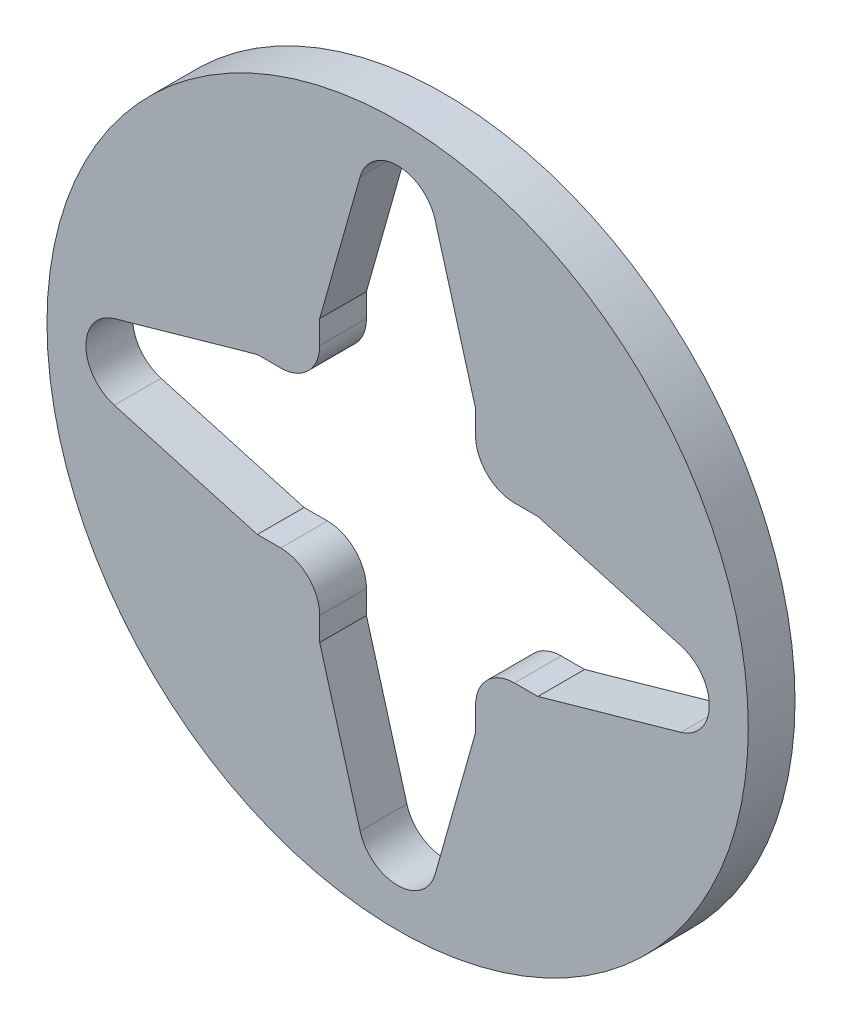
ISO-10303-21;
HEADER;
FILE_DESCRIPTION(('STEP AP214'),'2;1');
FILE_NAME('part.step','',(''),(''),'','','');
FILE_SCHEMA(('AUTOMOTIVE_DESIGN { 1 0 10303 214 1 1 1 1 }'));
ENDSEC;
DATA;
#1=APPLICATION_CONTEXT('core data for automotive mechanical design processes');
#2=APPLICATION_PROTOCOL_DEFINITION('international standard','automotive_design',2000,#1);
#3=PRODUCT_CONTEXT('',#1,'mechanical');
#4=PRODUCT('Part','Part','',(#3));
#5=PRODUCT_RELATED_PRODUCT_CATEGORY('part','',(#4));
#6=PRODUCT_DEFINITION_FORMATION('','',#4);
#7=PRODUCT_DEFINITION_CONTEXT('part definition',#1,'design');
#8=PRODUCT_DEFINITION('design','',#6,#7);
#9=PRODUCT_DEFINITION_SHAPE('','',#8);
#10=(LENGTH_UNIT() NAMED_UNIT(*) SI_UNIT(.MILLI.,.METRE.));
#11=(NAMED_UNIT(*) PLANE_ANGLE_UNIT() SI_UNIT($,.RADIAN.));
#12=(NAMED_UNIT(*) SI_UNIT($,.STERADIAN.) SOLID_ANGLE_UNIT());
#13=UNCERTAINTY_MEASURE_WITH_UNIT(LENGTH_MEASURE(1.E-05),#10,'distance_accuracy_value','');
#14=(GEOMETRIC_REPRESENTATION_CONTEXT(3) GLOBAL_UNCERTAINTY_ASSIGNED_CONTEXT((#13)) GLOBAL_UNIT_ASSIGNED_CONTEXT((#10,
#11,#12)) REPRESENTATION_CONTEXT('',''));
#15=CARTESIAN_POINT('',(0.,0.,0.));
#16=DIRECTION('',(0.,0.,1.));
#17=DIRECTION('',(1.,0.,0.));
#18=AXIS2_PLACEMENT_3D('',#15,#16,#17);
#19=CARTESIAN_POINT('',(0.,0.,3.));
#20=DIRECTION('',(0.,0.,-1.));
#21=DIRECTION('',(-1.,0.,0.));
#22=AXIS2_PLACEMENT_3D('',#19,#20,#21);
#23=CYLINDRICAL_SURFACE('',#22,22.5);
#24=CARTESIAN_POINT('',(0.,0.,0.));
#25=DIRECTION('',(0.,0.,1.));
#26=DIRECTION('',(1.,0.,0.));
#27=AXIS2_PLACEMENT_3D('',#24,#25,#26);
#28=CIRCLE('',#27,22.5);
#29=CARTESIAN_POINT('',(22.5,0.,0.));
#30=VERTEX_POINT('',#29);
#31=EDGE_CURVE('E427',#30,#30,#28,.T.);
#32=ORIENTED_EDGE('',*,*,#31,.T.);
#33=EDGE_LOOP('',(#32));
#34=FACE_BOUND('',#33,.T.);
#35=CARTESIAN_POINT('',(0.,0.,3.));
#36=DIRECTION('',(0.,0.,1.));
#37=DIRECTION('',(1.,0.,0.));
#38=AXIS2_PLACEMENT_3D('',#35,#36,#37);
#39=CIRCLE('',#38,22.5);
#40=CARTESIAN_POINT('',(22.5,0.,3.));
#41=VERTEX_POINT('',#40);
#42=EDGE_CURVE('E369',#41,#41,#39,.T.);
#43=ORIENTED_EDGE('',*,*,#42,.F.);
#44=EDGE_LOOP('',(#43));
#45=FACE_BOUND('',#44,.T.);
#46=ADVANCED_FACE('F181',(#34,#45),#23,.T.);
#47=CARTESIAN_POINT('',(5.,0.,3.));
#48=DIRECTION('',(1.,0.,0.));
#49=DIRECTION('',(0.,0.,-1.));
#50=AXIS2_PLACEMENT_3D('',#47,#48,#49);
#51=PLANE('',#50);
#52=DIRECTION('',(0.,-1.,0.));
#53=VECTOR('',#52,1.);
#54=CARTESIAN_POINT('',(5.,0.,0.));
#55=LINE('',#54,#53);
#56=CARTESIAN_POINT('',(5.,-7.5,0.));
#57=VERTEX_POINT('',#56);
#58=CARTESIAN_POINT('',(5.,-9.,0.));
#59=VERTEX_POINT('',#58);
#60=EDGE_CURVE('E375',#57,#59,#55,.T.);
#61=ORIENTED_EDGE('',*,*,#60,.T.);
#62=DIRECTION('',(0.,0.,-1.));
#63=VECTOR('',#62,1.);
#64=CARTESIAN_POINT('',(5.,-9.,3.));
#65=LINE('',#64,#63);
#66=CARTESIAN_POINT('',(5.,-9.,3.));
#67=VERTEX_POINT('',#66);
#68=EDGE_CURVE('E191',#67,#59,#65,.T.);
#69=ORIENTED_EDGE('',*,*,#68,.F.);
#70=DIRECTION('',(0.,-1.,0.));
#71=VECTOR('',#70,1.);
#72=CARTESIAN_POINT('',(5.,0.,3.));
#73=LINE('',#72,#71);
#74=CARTESIAN_POINT('',(5.,-7.5,3.));
#75=VERTEX_POINT('',#74);
#76=EDGE_CURVE('E430',#75,#67,#73,.T.);
#77=ORIENTED_EDGE('',*,*,#76,.F.);
#78=DIRECTION('',(0.,0.,-1.));
#79=VECTOR('',#78,1.);
#80=CARTESIAN_POINT('',(5.,-7.5,3.));
#81=LINE('',#80,#79);
#82=EDGE_CURVE('E12',#75,#57,#81,.T.);
#83=ORIENTED_EDGE('',*,*,#82,.T.);
#84=EDGE_LOOP('',(#61,#69,#77,#83));
#85=FACE_BOUND('',#84,.T.);
#86=ADVANCED_FACE('F528',(#85),#51,.F.);
#87=CARTESIAN_POINT('',(6.98551163473582,-1.97409711694024,3.));
#88=DIRECTION('',(0.962311898410698,-0.271948175535705,0.));
#89=DIRECTION('',(0.271948175535705,0.962311898410698,0.));
#90=AXIS2_PLACEMENT_3D('',#87,#88,#89);
#91=PLANE('',#90);
#92=DIRECTION('',(-0.271948175535705,-0.962311898410698,0.));
#93=VECTOR('',#92,1.);
#94=CARTESIAN_POINT('',(6.98551163473582,-1.97409711694024,0.));
#95=LINE('',#94,#93);
#96=CARTESIAN_POINT('',(2.40577974602674,-18.1798704388393,0.));
#97=VERTEX_POINT('',#96);
#98=EDGE_CURVE('E377',#59,#97,#95,.T.);
#99=ORIENTED_EDGE('',*,*,#98,.T.);
#100=DIRECTION('',(0.,0.,-1.));
#101=VECTOR('',#100,1.);
#102=CARTESIAN_POINT('',(2.40577974602674,-18.1798704388393,3.));
#103=LINE('',#102,#101);
#104=CARTESIAN_POINT('',(2.40577974602674,-18.1798704388393,3.));
#105=VERTEX_POINT('',#104);
#106=EDGE_CURVE('E472',#105,#97,#103,.T.);
#107=ORIENTED_EDGE('',*,*,#106,.F.);
#108=DIRECTION('',(-0.271948175535705,-0.962311898410698,0.));
#109=VECTOR('',#108,1.);
#110=CARTESIAN_POINT('',(6.98551163473582,-1.97409711694024,3.));
#111=LINE('',#110,#109);
#112=EDGE_CURVE('E524',#67,#105,#111,.T.);
#113=ORIENTED_EDGE('',*,*,#112,.F.);
#114=ORIENTED_EDGE('',*,*,#68,.T.);
#115=EDGE_LOOP('',(#99,#107,#113,#114));
#116=FACE_BOUND('',#115,.T.);
#117=ADVANCED_FACE('F523',(#116),#91,.F.);
#118=CARTESIAN_POINT('',(0.,-17.5,3.));
#119=DIRECTION('',(0.,0.,-1.));
#120=DIRECTION('',(-1.,0.,0.));
#121=AXIS2_PLACEMENT_3D('',#118,#119,#120);
#122=CYLINDRICAL_SURFACE('',#121,2.5);
#123=CARTESIAN_POINT('',(0.,-17.5,0.));
#124=DIRECTION('',(0.,0.,1.));
#125=DIRECTION('',(1.,0.,0.));
#126=AXIS2_PLACEMENT_3D('',#123,#124,#125);
#127=CIRCLE('',#126,2.5);
#128=CARTESIAN_POINT('',(-2.40577974602674,-18.1798704388393,0.));
#129=VERTEX_POINT('',#128);
#130=EDGE_CURVE('E380',#97,#129,#127,.F.);
#131=ORIENTED_EDGE('',*,*,#130,.T.);
#132=DIRECTION('',(0.,0.,-1.));
#133=VECTOR('',#132,1.);
#134=CARTESIAN_POINT('',(-2.40577974602674,-18.1798704388393,3.));
#135=LINE('',#134,#133);
#136=CARTESIAN_POINT('',(-2.40577974602674,-18.1798704388393,3.));
#137=VERTEX_POINT('',#136);
#138=EDGE_CURVE('E470',#137,#129,#135,.T.);
#139=ORIENTED_EDGE('',*,*,#138,.F.);
#140=CARTESIAN_POINT('',(0.,-17.5,3.));
#141=DIRECTION('',(0.,0.,1.));
#142=DIRECTION('',(1.,0.,0.));
#143=AXIS2_PLACEMENT_3D('',#140,#141,#142);
#144=CIRCLE('',#143,2.5);
#145=EDGE_CURVE('E520',#105,#137,#144,.F.);
#146=ORIENTED_EDGE('',*,*,#145,.F.);
#147=ORIENTED_EDGE('',*,*,#106,.T.);
#148=EDGE_LOOP('',(#131,#139,#146,#147));
#149=FACE_BOUND('',#148,.T.);
#150=ADVANCED_FACE('F517',(#149),#122,.F.);
#151=CARTESIAN_POINT('',(-6.98551163473582,-1.97409711694024,3.));
#152=DIRECTION('',(0.962311898410698,0.271948175535705,0.));
#153=DIRECTION('',(-0.271948175535705,0.962311898410698,0.));
#154=AXIS2_PLACEMENT_3D('',#151,#152,#153);
#155=PLANE('',#154);
#156=DIRECTION('',(0.271948175535705,-0.962311898410698,0.));
#157=VECTOR('',#156,1.);
#158=CARTESIAN_POINT('',(-6.98551163473582,-1.97409711694024,0.));
#159=LINE('',#158,#157);
#160=CARTESIAN_POINT('',(-5.,-9.,0.));
#161=VERTEX_POINT('',#160);
#162=EDGE_CURVE('E383',#161,#129,#159,.T.);
#163=ORIENTED_EDGE('',*,*,#162,.F.);
#164=DIRECTION('',(0.,0.,-1.));
#165=VECTOR('',#164,1.);
#166=CARTESIAN_POINT('',(-5.,-9.,3.));
#167=LINE('',#166,#165);
#168=CARTESIAN_POINT('',(-5.,-9.,3.));
#169=VERTEX_POINT('',#168);
#170=EDGE_CURVE('E468',#169,#161,#167,.T.);
#171=ORIENTED_EDGE('',*,*,#170,.F.);
#172=DIRECTION('',(0.271948175535705,-0.962311898410698,0.));
#173=VECTOR('',#172,1.);
#174=CARTESIAN_POINT('',(-6.98551163473582,-1.97409711694024,3.));
#175=LINE('',#174,#173);
#176=EDGE_CURVE('E827',#169,#137,#175,.T.);
#177=ORIENTED_EDGE('',*,*,#176,.T.);
#178=ORIENTED_EDGE('',*,*,#138,.T.);
#179=EDGE_LOOP('',(#163,#171,#177,#178));
#180=FACE_BOUND('',#179,.T.);
#181=ADVANCED_FACE('F512',(#180),#155,.T.);
#182=CARTESIAN_POINT('',(-5.,0.,3.));
#183=DIRECTION('',(1.,0.,0.));
#184=DIRECTION('',(0.,0.,-1.));
#185=AXIS2_PLACEMENT_3D('',#182,#183,#184);
#186=PLANE('',#185);
#187=DIRECTION('',(0.,-1.,0.));
#188=VECTOR('',#187,1.);
#189=CARTESIAN_POINT('',(-5.,0.,0.));
#190=LINE('',#189,#188);
#191=CARTESIAN_POINT('',(-5.,-7.5,0.));
#192=VERTEX_POINT('',#191);
#193=EDGE_CURVE('E386',#192,#161,#190,.T.);
#194=ORIENTED_EDGE('',*,*,#193,.F.);
#195=DIRECTION('',(0.,0.,-1.));
#196=VECTOR('',#195,1.);
#197=CARTESIAN_POINT('',(-5.,-7.5,3.));
#198=LINE('',#197,#196);
#199=CARTESIAN_POINT('',(-5.,-7.5,3.));
#200=VERTEX_POINT('',#199);
#201=EDGE_CURVE('E466',#200,#192,#198,.T.);
#202=ORIENTED_EDGE('',*,*,#201,.F.);
#203=DIRECTION('',(0.,-1.,0.));
#204=VECTOR('',#203,1.);
#205=CARTESIAN_POINT('',(-5.,0.,3.));
#206=LINE('',#205,#204);
#207=EDGE_CURVE('E508',#200,#169,#206,.T.);
#208=ORIENTED_EDGE('',*,*,#207,.T.);
#209=ORIENTED_EDGE('',*,*,#170,.T.);
#210=EDGE_LOOP('',(#194,#202,#208,#209));
#211=FACE_BOUND('',#210,.T.);
#212=ADVANCED_FACE('F505',(#211),#186,.T.);
#213=CARTESIAN_POINT('',(0.,-5.,3.));
#214=DIRECTION('',(0.,-1.,0.));
#215=DIRECTION('',(1.,0.,0.));
#216=AXIS2_PLACEMENT_3D('',#213,#214,#215);
#217=PLANE('',#216);
#218=DIRECTION('',(-1.,0.,0.));
#219=VECTOR('',#218,1.);
#220=CARTESIAN_POINT('',(0.,-5.,0.));
#221=LINE('',#220,#219);
#222=CARTESIAN_POINT('',(-7.5,-5.,0.));
#223=VERTEX_POINT('',#222);
#224=CARTESIAN_POINT('',(-9.,-5.,0.));
#225=VERTEX_POINT('',#224);
#226=EDGE_CURVE('E389',#223,#225,#221,.T.);
#227=ORIENTED_EDGE('',*,*,#226,.T.);
#228=DIRECTION('',(0.,0.,-1.));
#229=VECTOR('',#228,1.);
#230=CARTESIAN_POINT('',(-9.,-5.,3.));
#231=LINE('',#230,#229);
#232=CARTESIAN_POINT('',(-9.,-5.,3.));
#233=VERTEX_POINT('',#232);
#234=EDGE_CURVE('E461',#233,#225,#231,.T.);
#235=ORIENTED_EDGE('',*,*,#234,.F.);
#236=DIRECTION('',(-1.,0.,0.));
#237=VECTOR('',#236,1.);
#238=CARTESIAN_POINT('',(0.,-5.,3.));
#239=LINE('',#238,#237);
#240=CARTESIAN_POINT('',(-7.5,-5.,3.));
#241=VERTEX_POINT('',#240);
#242=EDGE_CURVE('E826',#241,#233,#239,.T.);
#243=ORIENTED_EDGE('',*,*,#242,.F.);
#244=DIRECTION('',(0.,0.,-1.));
#245=VECTOR('',#244,1.);
#246=CARTESIAN_POINT('',(-7.5,-5.,3.));
#247=LINE('',#246,#245);
#248=EDGE_CURVE('E464',#241,#223,#247,.T.);
#249=ORIENTED_EDGE('',*,*,#248,.T.);
#250=EDGE_LOOP('',(#227,#235,#243,#249));
#251=FACE_BOUND('',#250,.T.);
#252=ADVANCED_FACE('F577',(#251),#217,.F.);
#253=CARTESIAN_POINT('',(-1.97409711694023,-6.98551163473581,3.));
#254=DIRECTION('',(-0.271948175535704,-0.962311898410698,0.));
#255=DIRECTION('',(0.962311898410698,-0.271948175535704,0.));
#256=AXIS2_PLACEMENT_3D('',#253,#254,#255);
#257=PLANE('',#256);
#258=DIRECTION('',(-0.962311898410698,0.271948175535704,0.));
#259=VECTOR('',#258,1.);
#260=CARTESIAN_POINT('',(-1.97409711694023,-6.98551163473581,0.));
#261=LINE('',#260,#259);
#262=CARTESIAN_POINT('',(-18.1798704388393,-2.40577974602675,0.));
#263=VERTEX_POINT('',#262);
#264=EDGE_CURVE('E391',#225,#263,#261,.T.);
#265=ORIENTED_EDGE('',*,*,#264,.T.);
#266=DIRECTION('',(0.,0.,-1.));
#267=VECTOR('',#266,1.);
#268=CARTESIAN_POINT('',(-18.1798704388393,-2.40577974602675,3.));
#269=LINE('',#268,#267);
#270=CARTESIAN_POINT('',(-18.1798704388393,-2.40577974602675,3.));
#271=VERTEX_POINT('',#270);
#272=EDGE_CURVE('E458',#271,#263,#269,.T.);
#273=ORIENTED_EDGE('',*,*,#272,.F.);
#274=DIRECTION('',(-0.962311898410698,0.271948175535704,0.));
#275=VECTOR('',#274,1.);
#276=CARTESIAN_POINT('',(-1.97409711694023,-6.98551163473581,3.));
#277=LINE('',#276,#275);
#278=EDGE_CURVE('E823',#233,#271,#277,.T.);
#279=ORIENTED_EDGE('',*,*,#278,.F.);
#280=ORIENTED_EDGE('',*,*,#234,.T.);
#281=EDGE_LOOP('',(#265,#273,#279,#280));
#282=FACE_BOUND('',#281,.T.);
#283=ADVANCED_FACE('F580',(#282),#257,.F.);
#284=CARTESIAN_POINT('',(-17.5,0.,3.));
#285=DIRECTION('',(0.,0.,-1.));
#286=DIRECTION('',(-1.,0.,0.));
#287=AXIS2_PLACEMENT_3D('',#284,#285,#286);
#288=CYLINDRICAL_SURFACE('',#287,2.5);
#289=CARTESIAN_POINT('',(-17.5,0.,0.));
#290=DIRECTION('',(0.,0.,1.));
#291=DIRECTION('',(1.,0.,0.));
#292=AXIS2_PLACEMENT_3D('',#289,#290,#291);
#293=CIRCLE('',#292,2.5);
#294=CARTESIAN_POINT('',(-18.1798704388393,2.40577974602675,0.));
#295=VERTEX_POINT('',#294);
#296=EDGE_CURVE('E393',#263,#295,#293,.F.);
#297=ORIENTED_EDGE('',*,*,#296,.T.);
#298=DIRECTION('',(0.,0.,-1.));
#299=VECTOR('',#298,1.);
#300=CARTESIAN_POINT('',(-18.1798704388393,2.40577974602675,3.));
#301=LINE('',#300,#299);
#302=CARTESIAN_POINT('',(-18.1798704388393,2.40577974602675,3.));
#303=VERTEX_POINT('',#302);
#304=EDGE_CURVE('E456',#303,#295,#301,.T.);
#305=ORIENTED_EDGE('',*,*,#304,.F.);
#306=CARTESIAN_POINT('',(-17.5,0.,3.));
#307=DIRECTION('',(0.,0.,1.));
#308=DIRECTION('',(1.,0.,0.));
#309=AXIS2_PLACEMENT_3D('',#306,#307,#308);
#310=CIRCLE('',#309,2.5);
#311=EDGE_CURVE('E821',#271,#303,#310,.F.);
#312=ORIENTED_EDGE('',*,*,#311,.F.);
#313=ORIENTED_EDGE('',*,*,#272,.T.);
#314=EDGE_LOOP('',(#297,#305,#312,#313));
#315=FACE_BOUND('',#314,.T.);
#316=ADVANCED_FACE('F584',(#315),#288,.F.);
#317=CARTESIAN_POINT('',(-1.97409711694023,6.98551163473581,3.));
#318=DIRECTION('',(0.271948175535704,-0.962311898410698,0.));
#319=DIRECTION('',(0.962311898410698,0.271948175535704,0.));
#320=AXIS2_PLACEMENT_3D('',#317,#318,#319);
#321=PLANE('',#320);
#322=DIRECTION('',(-0.962311898410698,-0.271948175535704,0.));
#323=VECTOR('',#322,1.);
#324=CARTESIAN_POINT('',(-1.97409711694023,6.98551163473581,0.));
#325=LINE('',#324,#323);
#326=CARTESIAN_POINT('',(-9.,5.,0.));
#327=VERTEX_POINT('',#326);
#328=EDGE_CURVE('E396',#327,#295,#325,.T.);
#329=ORIENTED_EDGE('',*,*,#328,.F.);
#330=DIRECTION('',(0.,0.,-1.));
#331=VECTOR('',#330,1.);
#332=CARTESIAN_POINT('',(-9.,5.,3.));
#333=LINE('',#332,#331);
#334=CARTESIAN_POINT('',(-9.,5.,3.));
#335=VERTEX_POINT('',#334);
#336=EDGE_CURVE('E454',#335,#327,#333,.T.);
#337=ORIENTED_EDGE('',*,*,#336,.F.);
#338=DIRECTION('',(-0.962311898410698,-0.271948175535704,0.));
#339=VECTOR('',#338,1.);
#340=CARTESIAN_POINT('',(-1.97409711694023,6.98551163473581,3.));
#341=LINE('',#340,#339);
#342=EDGE_CURVE('E818',#335,#303,#341,.T.);
#343=ORIENTED_EDGE('',*,*,#342,.T.);
#344=ORIENTED_EDGE('',*,*,#304,.T.);
#345=EDGE_LOOP('',(#329,#337,#343,#344));
#346=FACE_BOUND('',#345,.T.);
#347=ADVANCED_FACE('F588',(#346),#321,.T.);
#348=CARTESIAN_POINT('',(0.,5.,3.));
#349=DIRECTION('',(0.,-1.,0.));
#350=DIRECTION('',(1.,0.,0.));
#351=AXIS2_PLACEMENT_3D('',#348,#349,#350);
#352=PLANE('',#351);
#353=DIRECTION('',(-1.,0.,0.));
#354=VECTOR('',#353,1.);
#355=CARTESIAN_POINT('',(0.,5.,0.));
#356=LINE('',#355,#354);
#357=CARTESIAN_POINT('',(-7.5,5.,0.));
#358=VERTEX_POINT('',#357);
#359=EDGE_CURVE('E399',#358,#327,#356,.T.);
#360=ORIENTED_EDGE('',*,*,#359,.F.);
#361=DIRECTION('',(0.,0.,-1.));
#362=VECTOR('',#361,1.);
#363=CARTESIAN_POINT('',(-7.5,5.,3.));
#364=LINE('',#363,#362);
#365=CARTESIAN_POINT('',(-7.5,5.,3.));
#366=VERTEX_POINT('',#365);
#367=EDGE_CURVE('E452',#366,#358,#364,.T.);
#368=ORIENTED_EDGE('',*,*,#367,.F.);
#369=DIRECTION('',(-1.,0.,0.));
#370=VECTOR('',#369,1.);
#371=CARTESIAN_POINT('',(0.,5.,3.));
#372=LINE('',#371,#370);
#373=EDGE_CURVE('E812',#366,#335,#372,.T.);
#374=ORIENTED_EDGE('',*,*,#373,.T.);
#375=ORIENTED_EDGE('',*,*,#336,.T.);
#376=EDGE_LOOP('',(#360,#368,#374,#375));
#377=FACE_BOUND('',#376,.T.);
#378=ADVANCED_FACE('F592',(#377),#352,.T.);
#379=CARTESIAN_POINT('',(-5.,0.,3.));
#380=DIRECTION('',(-1.,0.,0.));
#381=DIRECTION('',(0.,0.,1.));
#382=AXIS2_PLACEMENT_3D('',#379,#380,#381);
#383=PLANE('',#382);
#384=DIRECTION('',(0.,1.,0.));
#385=VECTOR('',#384,1.);
#386=CARTESIAN_POINT('',(-5.,0.,0.));
#387=LINE('',#386,#385);
#388=CARTESIAN_POINT('',(-5.,7.5,0.));
#389=VERTEX_POINT('',#388);
#390=CARTESIAN_POINT('',(-5.,9.,0.));
#391=VERTEX_POINT('',#390);
#392=EDGE_CURVE('E402',#389,#391,#387,.T.);
#393=ORIENTED_EDGE('',*,*,#392,.T.);
#394=DIRECTION('',(0.,0.,-1.));
#395=VECTOR('',#394,1.);
#396=CARTESIAN_POINT('',(-5.,9.,3.));
#397=LINE('',#396,#395);
#398=CARTESIAN_POINT('',(-5.,9.,3.));
#399=VERTEX_POINT('',#398);
#400=EDGE_CURVE('E447',#399,#391,#397,.T.);
#401=ORIENTED_EDGE('',*,*,#400,.F.);
#402=DIRECTION('',(0.,1.,0.));
#403=VECTOR('',#402,1.);
#404=CARTESIAN_POINT('',(-5.,0.,3.));
#405=LINE('',#404,#403);
#406=CARTESIAN_POINT('',(-5.,7.5,3.));
#407=VERTEX_POINT('',#406);
#408=EDGE_CURVE('E808',#407,#399,#405,.T.);
#409=ORIENTED_EDGE('',*,*,#408,.F.);
#410=DIRECTION('',(0.,0.,-1.));
#411=VECTOR('',#410,1.);
#412=CARTESIAN_POINT('',(-5.,7.5,3.));
#413=LINE('',#412,#411);
#414=EDGE_CURVE('E450',#407,#389,#413,.T.);
#415=ORIENTED_EDGE('',*,*,#414,.T.);
#416=EDGE_LOOP('',(#393,#401,#409,#415));
#417=FACE_BOUND('',#416,.T.);
#418=ADVANCED_FACE('F596',(#417),#383,.F.);
#419=CARTESIAN_POINT('',(-6.98551163473582,1.97409711694024,3.));
#420=DIRECTION('',(-0.962311898410698,0.271948175535705,0.));
#421=DIRECTION('',(-0.271948175535705,-0.962311898410698,0.));
#422=AXIS2_PLACEMENT_3D('',#419,#420,#421);
#423=PLANE('',#422);
#424=DIRECTION('',(0.271948175535705,0.962311898410698,0.));
#425=VECTOR('',#424,1.);
#426=CARTESIAN_POINT('',(-6.98551163473582,1.97409711694024,0.));
#427=LINE('',#426,#425);
#428=CARTESIAN_POINT('',(-2.40577974602674,18.1798704388393,0.));
#429=VERTEX_POINT('',#428);
#430=EDGE_CURVE('E404',#391,#429,#427,.T.);
#431=ORIENTED_EDGE('',*,*,#430,.T.);
#432=DIRECTION('',(0.,0.,-1.));
#433=VECTOR('',#432,1.);
#434=CARTESIAN_POINT('',(-2.40577974602674,18.1798704388393,3.));
#435=LINE('',#434,#433);
#436=CARTESIAN_POINT('',(-2.40577974602674,18.1798704388393,3.));
#437=VERTEX_POINT('',#436);
#438=EDGE_CURVE('E445',#437,#429,#435,.T.);
#439=ORIENTED_EDGE('',*,*,#438,.F.);
#440=DIRECTION('',(0.271948175535705,0.962311898410698,0.));
#441=VECTOR('',#440,1.);
#442=CARTESIAN_POINT('',(-6.98551163473582,1.97409711694024,3.));
#443=LINE('',#442,#441);
#444=EDGE_CURVE('E838',#399,#437,#443,.T.);
#445=ORIENTED_EDGE('',*,*,#444,.F.);
#446=ORIENTED_EDGE('',*,*,#400,.T.);
#447=EDGE_LOOP('',(#431,#439,#445,#446));
#448=FACE_BOUND('',#447,.T.);
#449=ADVANCED_FACE('F600',(#448),#423,.F.);
#450=CARTESIAN_POINT('',(0.,17.5,3.));
#451=DIRECTION('',(0.,0.,-1.));
#452=DIRECTION('',(-1.,0.,0.));
#453=AXIS2_PLACEMENT_3D('',#450,#451,#452);
#454=CYLINDRICAL_SURFACE('',#453,2.5);
#455=CARTESIAN_POINT('',(0.,17.5,0.));
#456=DIRECTION('',(0.,0.,1.));
#457=DIRECTION('',(1.,0.,0.));
#458=AXIS2_PLACEMENT_3D('',#455,#456,#457);
#459=CIRCLE('',#458,2.5);
#460=CARTESIAN_POINT('',(2.40577974602674,18.1798704388393,0.));
#461=VERTEX_POINT('',#460);
#462=EDGE_CURVE('E407',#461,#429,#459,.T.);
#463=ORIENTED_EDGE('',*,*,#462,.F.);
#464=DIRECTION('',(0.,0.,-1.));
#465=VECTOR('',#464,1.);
#466=CARTESIAN_POINT('',(2.40577974602674,18.1798704388393,3.));
#467=LINE('',#466,#465);
#468=CARTESIAN_POINT('',(2.40577974602674,18.1798704388393,3.));
#469=VERTEX_POINT('',#468);
#470=EDGE_CURVE('E443',#469,#461,#467,.T.);
#471=ORIENTED_EDGE('',*,*,#470,.F.);
#472=CARTESIAN_POINT('',(0.,17.5,3.));
#473=DIRECTION('',(0.,0.,1.));
#474=DIRECTION('',(1.,0.,0.));
#475=AXIS2_PLACEMENT_3D('',#472,#473,#474);
#476=CIRCLE('',#475,2.5);
#477=EDGE_CURVE('E801',#469,#437,#476,.T.);
#478=ORIENTED_EDGE('',*,*,#477,.T.);
#479=ORIENTED_EDGE('',*,*,#438,.T.);
#480=EDGE_LOOP('',(#463,#471,#478,#479));
#481=FACE_BOUND('',#480,.T.);
#482=ADVANCED_FACE('F604',(#481),#454,.F.);
#483=CARTESIAN_POINT('',(6.98551163473582,1.97409711694024,3.));
#484=DIRECTION('',(-0.962311898410698,-0.271948175535705,0.));
#485=DIRECTION('',(0.271948175535705,-0.962311898410698,0.));
#486=AXIS2_PLACEMENT_3D('',#483,#484,#485);
#487=PLANE('',#486);
#488=DIRECTION('',(-0.271948175535705,0.962311898410698,0.));
#489=VECTOR('',#488,1.);
#490=CARTESIAN_POINT('',(6.98551163473582,1.97409711694024,0.));
#491=LINE('',#490,#489);
#492=CARTESIAN_POINT('',(5.,9.,0.));
#493=VERTEX_POINT('',#492);
#494=EDGE_CURVE('E410',#493,#461,#491,.T.);
#495=ORIENTED_EDGE('',*,*,#494,.F.);
#496=DIRECTION('',(0.,0.,-1.));
#497=VECTOR('',#496,1.);
#498=CARTESIAN_POINT('',(5.,9.,3.));
#499=LINE('',#498,#497);
#500=CARTESIAN_POINT('',(5.,9.,3.));
#501=VERTEX_POINT('',#500);
#502=EDGE_CURVE('E441',#501,#493,#499,.T.);
#503=ORIENTED_EDGE('',*,*,#502,.F.);
#504=DIRECTION('',(-0.271948175535705,0.962311898410698,0.));
#505=VECTOR('',#504,1.);
#506=CARTESIAN_POINT('',(6.98551163473582,1.97409711694024,3.));
#507=LINE('',#506,#505);
#508=EDGE_CURVE('E797',#501,#469,#507,.T.);
#509=ORIENTED_EDGE('',*,*,#508,.T.);
#510=ORIENTED_EDGE('',*,*,#470,.T.);
#511=EDGE_LOOP('',(#495,#503,#509,#510));
#512=FACE_BOUND('',#511,.T.);
#513=ADVANCED_FACE('F608',(#512),#487,.T.);
#514=CARTESIAN_POINT('',(5.,0.,3.));
#515=DIRECTION('',(-1.,0.,0.));
#516=DIRECTION('',(0.,0.,1.));
#517=AXIS2_PLACEMENT_3D('',#514,#515,#516);
#518=PLANE('',#517);
#519=DIRECTION('',(0.,1.,0.));
#520=VECTOR('',#519,1.);
#521=CARTESIAN_POINT('',(5.,0.,0.));
#522=LINE('',#521,#520);
#523=CARTESIAN_POINT('',(5.,7.5,0.));
#524=VERTEX_POINT('',#523);
#525=EDGE_CURVE('E413',#524,#493,#522,.T.);
#526=ORIENTED_EDGE('',*,*,#525,.F.);
#527=DIRECTION('',(0.,0.,-1.));
#528=VECTOR('',#527,1.);
#529=CARTESIAN_POINT('',(5.,7.5,3.));
#530=LINE('',#529,#528);
#531=CARTESIAN_POINT('',(5.,7.5,3.));
#532=VERTEX_POINT('',#531);
#533=EDGE_CURVE('E439',#532,#524,#530,.T.);
#534=ORIENTED_EDGE('',*,*,#533,.F.);
#535=DIRECTION('',(0.,1.,0.));
#536=VECTOR('',#535,1.);
#537=CARTESIAN_POINT('',(5.,0.,3.));
#538=LINE('',#537,#536);
#539=EDGE_CURVE('E791',#532,#501,#538,.T.);
#540=ORIENTED_EDGE('',*,*,#539,.T.);
#541=ORIENTED_EDGE('',*,*,#502,.T.);
#542=EDGE_LOOP('',(#526,#534,#540,#541));
#543=FACE_BOUND('',#542,.T.);
#544=ADVANCED_FACE('F612',(#543),#518,.T.);
#545=CARTESIAN_POINT('',(0.,5.,3.));
#546=DIRECTION('',(0.,1.,0.));
#547=DIRECTION('',(-1.,0.,0.));
#548=AXIS2_PLACEMENT_3D('',#545,#546,#547);
#549=PLANE('',#548);
#550=DIRECTION('',(1.,0.,0.));
#551=VECTOR('',#550,1.);
#552=CARTESIAN_POINT('',(0.,5.,0.));
#553=LINE('',#552,#551);
#554=CARTESIAN_POINT('',(7.5,5.,0.));
#555=VERTEX_POINT('',#554);
#556=CARTESIAN_POINT('',(9.,5.,0.));
#557=VERTEX_POINT('',#556);
#558=EDGE_CURVE('E416',#555,#557,#553,.T.);
#559=ORIENTED_EDGE('',*,*,#558,.T.);
#560=DIRECTION('',(0.,0.,-1.));
#561=VECTOR('',#560,1.);
#562=CARTESIAN_POINT('',(9.,5.,3.));
#563=LINE('',#562,#561);
#564=CARTESIAN_POINT('',(9.,5.,3.));
#565=VERTEX_POINT('',#564);
#566=EDGE_CURVE('E434',#565,#557,#563,.T.);
#567=ORIENTED_EDGE('',*,*,#566,.F.);
#568=DIRECTION('',(1.,0.,0.));
#569=VECTOR('',#568,1.);
#570=CARTESIAN_POINT('',(0.,5.,3.));
#571=LINE('',#570,#569);
#572=CARTESIAN_POINT('',(7.5,5.,3.));
#573=VERTEX_POINT('',#572);
#574=EDGE_CURVE('E787',#573,#565,#571,.T.);
#575=ORIENTED_EDGE('',*,*,#574,.F.);
#576=DIRECTION('',(0.,0.,-1.));
#577=VECTOR('',#576,1.);
#578=CARTESIAN_POINT('',(7.5,5.,3.));
#579=LINE('',#578,#577);
#580=EDGE_CURVE('E437',#573,#555,#579,.T.);
#581=ORIENTED_EDGE('',*,*,#580,.T.);
#582=EDGE_LOOP('',(#559,#567,#575,#581));
#583=FACE_BOUND('',#582,.T.);
#584=ADVANCED_FACE('F616',(#583),#549,.F.);
#585=CARTESIAN_POINT('',(1.97409711694023,6.98551163473581,3.));
#586=DIRECTION('',(0.271948175535704,0.962311898410698,0.));
#587=DIRECTION('',(-0.962311898410698,0.271948175535704,0.));
#588=AXIS2_PLACEMENT_3D('',#585,#586,#587);
#589=PLANE('',#588);
#590=DIRECTION('',(0.962311898410698,-0.271948175535704,0.));
#591=VECTOR('',#590,1.);
#592=CARTESIAN_POINT('',(1.97409711694023,6.98551163473581,0.));
#593=LINE('',#592,#591);
#594=CARTESIAN_POINT('',(18.1798704388393,2.40577974602675,0.));
#595=VERTEX_POINT('',#594);
#596=EDGE_CURVE('E418',#557,#595,#593,.T.);
#597=ORIENTED_EDGE('',*,*,#596,.T.);
#598=DIRECTION('',(0.,0.,-1.));
#599=VECTOR('',#598,1.);
#600=CARTESIAN_POINT('',(18.1798704388393,2.40577974602675,3.));
#601=LINE('',#600,#599);
#602=CARTESIAN_POINT('',(18.1798704388393,2.40577974602675,3.));
#603=VERTEX_POINT('',#602);
#604=EDGE_CURVE('E355',#603,#595,#601,.T.);
#605=ORIENTED_EDGE('',*,*,#604,.F.);
#606=DIRECTION('',(0.962311898410698,-0.271948175535704,0.));
#607=VECTOR('',#606,1.);
#608=CARTESIAN_POINT('',(1.97409711694023,6.98551163473581,3.));
#609=LINE('',#608,#607);
#610=EDGE_CURVE('E363',#565,#603,#609,.T.);
#611=ORIENTED_EDGE('',*,*,#610,.F.);
#612=ORIENTED_EDGE('',*,*,#566,.T.);
#613=EDGE_LOOP('',(#597,#605,#611,#612));
#614=FACE_BOUND('',#613,.T.);
#615=ADVANCED_FACE('F620',(#614),#589,.F.);
#616=CARTESIAN_POINT('',(17.5,0.,3.));
#617=DIRECTION('',(0.,0.,-1.));
#618=DIRECTION('',(-1.,0.,0.));
#619=AXIS2_PLACEMENT_3D('',#616,#617,#618);
#620=CYLINDRICAL_SURFACE('',#619,2.5);
#621=CARTESIAN_POINT('',(17.5,0.,0.));
#622=DIRECTION('',(0.,0.,1.));
#623=DIRECTION('',(1.,0.,0.));
#624=AXIS2_PLACEMENT_3D('',#621,#622,#623);
#625=CIRCLE('',#624,2.5);
#626=CARTESIAN_POINT('',(18.1798704388393,-2.40577974602675,0.));
#627=VERTEX_POINT('',#626);
#628=EDGE_CURVE('E351',#627,#595,#625,.T.);
#629=ORIENTED_EDGE('',*,*,#628,.F.);
#630=DIRECTION('',(0.,0.,-1.));
#631=VECTOR('',#630,1.);
#632=CARTESIAN_POINT('',(18.1798704388393,-2.40577974602675,3.));
#633=LINE('',#632,#631);
#634=CARTESIAN_POINT('',(18.1798704388393,-2.40577974602675,3.));
#635=VERTEX_POINT('',#634);
#636=EDGE_CURVE('E346',#635,#627,#633,.T.);
#637=ORIENTED_EDGE('',*,*,#636,.F.);
#638=CARTESIAN_POINT('',(17.5,0.,3.));
#639=DIRECTION('',(0.,0.,1.));
#640=DIRECTION('',(1.,0.,0.));
#641=AXIS2_PLACEMENT_3D('',#638,#639,#640);
#642=CIRCLE('',#641,2.5);
#643=EDGE_CURVE('E349',#635,#603,#642,.T.);
#644=ORIENTED_EDGE('',*,*,#643,.T.);
#645=ORIENTED_EDGE('',*,*,#604,.T.);
#646=EDGE_LOOP('',(#629,#637,#644,#645));
#647=FACE_BOUND('',#646,.T.);
#648=ADVANCED_FACE('F348',(#647),#620,.F.);
#649=CARTESIAN_POINT('',(1.97409711694023,-6.98551163473581,3.));
#650=DIRECTION('',(-0.271948175535704,0.962311898410698,0.));
#651=DIRECTION('',(-0.962311898410698,-0.271948175535704,0.));
#652=AXIS2_PLACEMENT_3D('',#649,#650,#651);
#653=PLANE('',#652);
#654=DIRECTION('',(0.962311898410698,0.271948175535704,0.));
#655=VECTOR('',#654,1.);
#656=CARTESIAN_POINT('',(1.97409711694023,-6.98551163473581,0.));
#657=LINE('',#656,#655);
#658=CARTESIAN_POINT('',(9.,-5.,0.));
#659=VERTEX_POINT('',#658);
#660=EDGE_CURVE('E422',#659,#627,#657,.T.);
#661=ORIENTED_EDGE('',*,*,#660,.F.);
#662=DIRECTION('',(0.,0.,-1.));
#663=VECTOR('',#662,1.);
#664=CARTESIAN_POINT('',(9.,-5.,3.));
#665=LINE('',#664,#663);
#666=CARTESIAN_POINT('',(9.,-5.,3.));
#667=VERTEX_POINT('',#666);
#668=EDGE_CURVE('E273',#667,#659,#665,.T.);
#669=ORIENTED_EDGE('',*,*,#668,.F.);
#670=DIRECTION('',(0.962311898410698,0.271948175535704,0.));
#671=VECTOR('',#670,1.);
#672=CARTESIAN_POINT('',(1.97409711694023,-6.98551163473581,3.));
#673=LINE('',#672,#671);
#674=EDGE_CURVE('E361',#667,#635,#673,.T.);
#675=ORIENTED_EDGE('',*,*,#674,.T.);
#676=ORIENTED_EDGE('',*,*,#636,.T.);
#677=EDGE_LOOP('',(#661,#669,#675,#676));
#678=FACE_BOUND('',#677,.T.);
#679=ADVANCED_FACE('F366',(#678),#653,.T.);
#680=CARTESIAN_POINT('',(0.,-5.,3.));
#681=DIRECTION('',(0.,1.,0.));
#682=DIRECTION('',(0.,0.,1.));
#683=AXIS2_PLACEMENT_3D('',#680,#681,#682);
#684=PLANE('',#683);
#685=DIRECTION('',(1.,0.,0.));
#686=VECTOR('',#685,1.);
#687=CARTESIAN_POINT('',(0.,-5.,0.));
#688=LINE('',#687,#686);
#689=CARTESIAN_POINT('',(7.5,-5.,0.));
#690=VERTEX_POINT('',#689);
#691=EDGE_CURVE('E424',#690,#659,#688,.T.);
#692=ORIENTED_EDGE('',*,*,#691,.F.);
#693=DIRECTION('',(0.,0.,-1.));
#694=VECTOR('',#693,1.);
#695=CARTESIAN_POINT('',(7.5,-5.,3.));
#696=LINE('',#695,#694);
#697=CARTESIAN_POINT('',(7.5,-5.,3.));
#698=VERTEX_POINT('',#697);
#699=EDGE_CURVE('E200',#698,#690,#696,.T.);
#700=ORIENTED_EDGE('',*,*,#699,.F.);
#701=DIRECTION('',(1.,0.,0.));
#702=VECTOR('',#701,1.);
#703=CARTESIAN_POINT('',(0.,-5.,3.));
#704=LINE('',#703,#702);
#705=EDGE_CURVE('E367',#698,#667,#704,.T.);
#706=ORIENTED_EDGE('',*,*,#705,.T.);
#707=ORIENTED_EDGE('',*,*,#668,.T.);
#708=EDGE_LOOP('',(#692,#700,#706,#707));
#709=FACE_BOUND('',#708,.T.);
#710=ADVANCED_FACE('F529',(#709),#684,.T.);
#711=CARTESIAN_POINT('',(0.,0.,0.));
#712=DIRECTION('',(0.,0.,1.));
#713=DIRECTION('',(1.,0.,0.));
#714=AXIS2_PLACEMENT_3D('',#711,#712,#713);
#715=PLANE('',#714);
#716=ORIENTED_EDGE('',*,*,#31,.F.);
#717=EDGE_LOOP('',(#716));
#718=FACE_BOUND('',#717,.T.);
#719=ORIENTED_EDGE('',*,*,#60,.F.);
#720=CARTESIAN_POINT('',(7.5,-7.5,0.));
#721=DIRECTION('',(0.,0.,1.));
#722=DIRECTION('',(1.,0.,0.));
#723=AXIS2_PLACEMENT_3D('',#720,#721,#722);
#724=CIRCLE('',#723,2.5);
#725=EDGE_CURVE('E490',#690,#57,#724,.T.);
#726=ORIENTED_EDGE('',*,*,#725,.F.);
#727=ORIENTED_EDGE('',*,*,#691,.T.);
#728=ORIENTED_EDGE('',*,*,#660,.T.);
#729=ORIENTED_EDGE('',*,*,#628,.T.);
#730=ORIENTED_EDGE('',*,*,#596,.F.);
#731=ORIENTED_EDGE('',*,*,#558,.F.);
#732=CARTESIAN_POINT('',(7.5,7.5,0.));
#733=DIRECTION('',(0.,0.,-1.));
#734=DIRECTION('',(-1.,0.,0.));
#735=AXIS2_PLACEMENT_3D('',#732,#733,#734);
#736=CIRCLE('',#735,2.5);
#737=EDGE_CURVE('E485',#555,#524,#736,.T.);
#738=ORIENTED_EDGE('',*,*,#737,.T.);
#739=ORIENTED_EDGE('',*,*,#525,.T.);
#740=ORIENTED_EDGE('',*,*,#494,.T.);
#741=ORIENTED_EDGE('',*,*,#462,.T.);
#742=ORIENTED_EDGE('',*,*,#430,.F.);
#743=ORIENTED_EDGE('',*,*,#392,.F.);
#744=CARTESIAN_POINT('',(-7.5,7.5,0.));
#745=DIRECTION('',(0.,0.,1.));
#746=DIRECTION('',(1.,0.,0.));
#747=AXIS2_PLACEMENT_3D('',#744,#745,#746);
#748=CIRCLE('',#747,2.5);
#749=EDGE_CURVE('E479',#358,#389,#748,.T.);
#750=ORIENTED_EDGE('',*,*,#749,.F.);
#751=ORIENTED_EDGE('',*,*,#359,.T.);
#752=ORIENTED_EDGE('',*,*,#328,.T.);
#753=ORIENTED_EDGE('',*,*,#296,.F.);
#754=ORIENTED_EDGE('',*,*,#264,.F.);
#755=ORIENTED_EDGE('',*,*,#226,.F.);
#756=CARTESIAN_POINT('',(-7.5,-7.5,0.));
#757=DIRECTION('',(0.,0.,-1.));
#758=DIRECTION('',(-1.,0.,0.));
#759=AXIS2_PLACEMENT_3D('',#756,#757,#758);
#760=CIRCLE('',#759,2.5);
#761=EDGE_CURVE('E185',#223,#192,#760,.T.);
#762=ORIENTED_EDGE('',*,*,#761,.T.);
#763=ORIENTED_EDGE('',*,*,#193,.T.);
#764=ORIENTED_EDGE('',*,*,#162,.T.);
#765=ORIENTED_EDGE('',*,*,#130,.F.);
#766=ORIENTED_EDGE('',*,*,#98,.F.);
#767=EDGE_LOOP('',(#719,#726,#727,#728,#729,#730,#731,#738,#739,#740,#741,#742,#743,#750,#751,
#752,#753,#754,#755,#762,#763,#764,#765,#766));
#768=FACE_BOUND('',#767,.T.);
#769=ADVANCED_FACE('F502',(#718,#768),#715,.F.);
#770=CARTESIAN_POINT('',(0.,0.,3.));
#771=DIRECTION('',(0.,0.,1.));
#772=DIRECTION('',(1.,0.,0.));
#773=AXIS2_PLACEMENT_3D('',#770,#771,#772);
#774=PLANE('',#773);
#775=ORIENTED_EDGE('',*,*,#42,.T.);
#776=EDGE_LOOP('',(#775));
#777=FACE_BOUND('',#776,.T.);
#778=ORIENTED_EDGE('',*,*,#705,.F.);
#779=CARTESIAN_POINT('',(7.5,-7.5,3.));
#780=DIRECTION('',(0.,0.,1.));
#781=DIRECTION('',(1.,0.,0.));
#782=AXIS2_PLACEMENT_3D('',#779,#780,#781);
#783=CIRCLE('',#782,2.5);
#784=EDGE_CURVE('E488',#698,#75,#783,.T.);
#785=ORIENTED_EDGE('',*,*,#784,.T.);
#786=ORIENTED_EDGE('',*,*,#76,.T.);
#787=ORIENTED_EDGE('',*,*,#112,.T.);
#788=ORIENTED_EDGE('',*,*,#145,.T.);
#789=ORIENTED_EDGE('',*,*,#176,.F.);
#790=ORIENTED_EDGE('',*,*,#207,.F.);
#791=CARTESIAN_POINT('',(-7.5,-7.5,3.));
#792=DIRECTION('',(0.,0.,-1.));
#793=DIRECTION('',(-1.,0.,0.));
#794=AXIS2_PLACEMENT_3D('',#791,#792,#793);
#795=CIRCLE('',#794,2.5);
#796=EDGE_CURVE('E491',#241,#200,#795,.T.);
#797=ORIENTED_EDGE('',*,*,#796,.F.);
#798=ORIENTED_EDGE('',*,*,#242,.T.);
#799=ORIENTED_EDGE('',*,*,#278,.T.);
#800=ORIENTED_EDGE('',*,*,#311,.T.);
#801=ORIENTED_EDGE('',*,*,#342,.F.);
#802=ORIENTED_EDGE('',*,*,#373,.F.);
#803=CARTESIAN_POINT('',(-7.5,7.5,3.));
#804=DIRECTION('',(0.,0.,1.));
#805=DIRECTION('',(1.,0.,0.));
#806=AXIS2_PLACEMENT_3D('',#803,#804,#805);
#807=CIRCLE('',#806,2.5);
#808=EDGE_CURVE('E378',#366,#407,#807,.T.);
#809=ORIENTED_EDGE('',*,*,#808,.T.);
#810=ORIENTED_EDGE('',*,*,#408,.T.);
#811=ORIENTED_EDGE('',*,*,#444,.T.);
#812=ORIENTED_EDGE('',*,*,#477,.F.);
#813=ORIENTED_EDGE('',*,*,#508,.F.);
#814=ORIENTED_EDGE('',*,*,#539,.F.);
#815=CARTESIAN_POINT('',(7.5,7.5,3.));
#816=DIRECTION('',(0.,0.,-1.));
#817=DIRECTION('',(-1.,0.,0.));
#818=AXIS2_PLACEMENT_3D('',#815,#816,#817);
#819=CIRCLE('',#818,2.5);
#820=EDGE_CURVE('E482',#573,#532,#819,.T.);
#821=ORIENTED_EDGE('',*,*,#820,.F.);
#822=ORIENTED_EDGE('',*,*,#574,.T.);
#823=ORIENTED_EDGE('',*,*,#610,.T.);
#824=ORIENTED_EDGE('',*,*,#643,.F.);
#825=ORIENTED_EDGE('',*,*,#674,.F.);
#826=EDGE_LOOP('',(#778,#785,#786,#787,#788,#789,#790,#797,#798,#799,#800,#801,#802,#809,#810,
#811,#812,#813,#814,#821,#822,#823,#824,#825));
#827=FACE_BOUND('',#826,.T.);
#828=ADVANCED_FACE('F360',(#777,#827),#774,.T.);
#829=CARTESIAN_POINT('',(-7.5,-7.5,3.));
#830=DIRECTION('',(0.,0.,-1.));
#831=DIRECTION('',(-1.,0.,0.));
#832=AXIS2_PLACEMENT_3D('',#829,#830,#831);
#833=CYLINDRICAL_SURFACE('',#832,2.5);
#834=ORIENTED_EDGE('',*,*,#796,.T.);
#835=ORIENTED_EDGE('',*,*,#201,.T.);
#836=ORIENTED_EDGE('',*,*,#761,.F.);
#837=ORIENTED_EDGE('',*,*,#248,.F.);
#838=EDGE_LOOP('',(#834,#835,#836,#837));
#839=FACE_BOUND('',#838,.T.);
#840=ADVANCED_FACE('F183',(#839),#833,.T.);
#841=CARTESIAN_POINT('',(7.5,-7.5,3.));
#842=DIRECTION('',(0.,0.,-1.));
#843=DIRECTION('',(-1.,0.,0.));
#844=AXIS2_PLACEMENT_3D('',#841,#842,#843);
#845=CYLINDRICAL_SURFACE('',#844,2.5);
#846=ORIENTED_EDGE('',*,*,#725,.T.);
#847=ORIENTED_EDGE('',*,*,#82,.F.);
#848=ORIENTED_EDGE('',*,*,#784,.F.);
#849=ORIENTED_EDGE('',*,*,#699,.T.);
#850=EDGE_LOOP('',(#846,#847,#848,#849));
#851=FACE_BOUND('',#850,.T.);
#852=ADVANCED_FACE('F554',(#851),#845,.T.);
#853=CARTESIAN_POINT('',(7.5,7.5,3.));
#854=DIRECTION('',(0.,0.,-1.));
#855=DIRECTION('',(-1.,0.,0.));
#856=AXIS2_PLACEMENT_3D('',#853,#854,#855);
#857=CYLINDRICAL_SURFACE('',#856,2.5);
#858=ORIENTED_EDGE('',*,*,#820,.T.);
#859=ORIENTED_EDGE('',*,*,#533,.T.);
#860=ORIENTED_EDGE('',*,*,#737,.F.);
#861=ORIENTED_EDGE('',*,*,#580,.F.);
#862=EDGE_LOOP('',(#858,#859,#860,#861));
#863=FACE_BOUND('',#862,.T.);
#864=ADVANCED_FACE('F559',(#863),#857,.T.);
#865=CARTESIAN_POINT('',(-7.5,7.5,3.));
#866=DIRECTION('',(0.,0.,-1.));
#867=DIRECTION('',(-1.,0.,0.));
#868=AXIS2_PLACEMENT_3D('',#865,#866,#867);
#869=CYLINDRICAL_SURFACE('',#868,2.5);
#870=ORIENTED_EDGE('',*,*,#808,.F.);
#871=ORIENTED_EDGE('',*,*,#367,.T.);
#872=ORIENTED_EDGE('',*,*,#749,.T.);
#873=ORIENTED_EDGE('',*,*,#414,.F.);
#874=EDGE_LOOP('',(#870,#871,#872,#873));
#875=FACE_BOUND('',#874,.T.);
#876=ADVANCED_FACE('F563',(#875),#869,.T.);
#877=CLOSED_SHELL('',(#46,#86,#117,#150,#181,#212,#252,#283,#316,#347,#378,#418,#449,#482,#513,
#544,#584,#615,#648,#679,#710,#769,#828,#840,#852,#864,#876));
#878=MANIFOLD_SOLID_BREP('B2',#877);
#879=ADVANCED_BREP_SHAPE_REPRESENTATION('',(#18,#878),#14);
#880=SHAPE_DEFINITION_REPRESENTATION(#9,#879);
ENDSEC;
END-ISO-10303-21;
